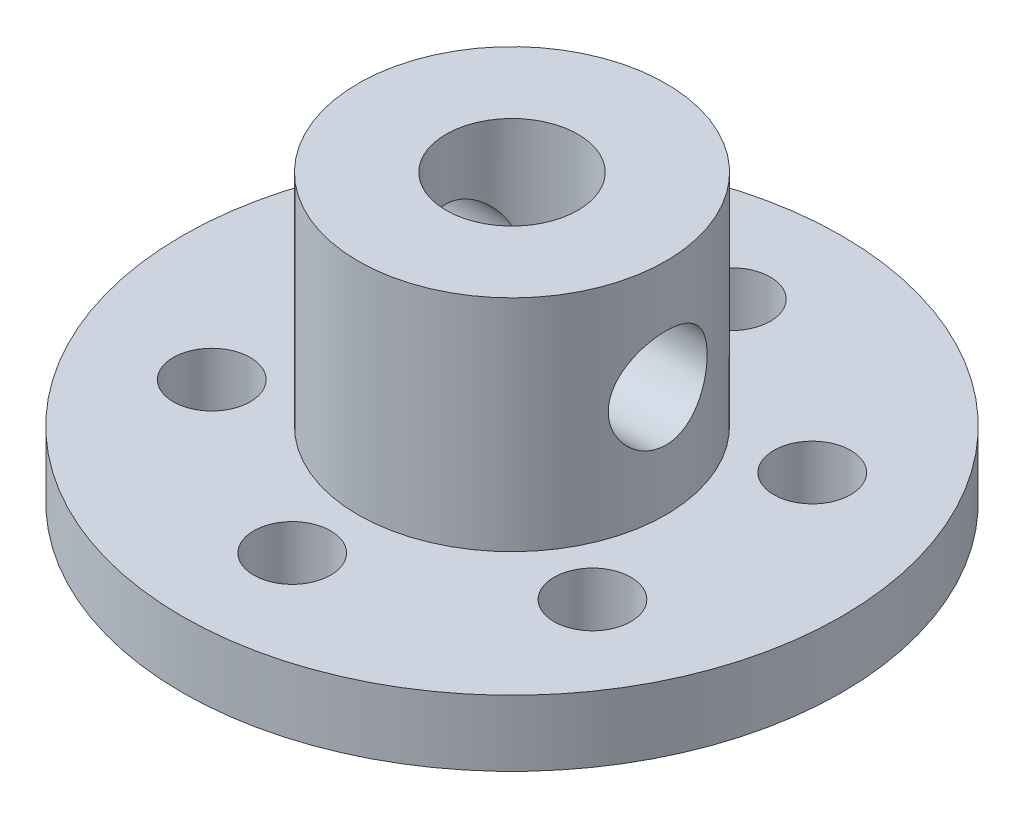
ISO-10303-21;
HEADER;
FILE_DESCRIPTION(('STEP AP214'),'2;1');
FILE_NAME('part.step','',(''),(''),'','','');
FILE_SCHEMA(('AUTOMOTIVE_DESIGN { 1 0 10303 214 1 1 1 1 }'));
ENDSEC;
DATA;
#1=APPLICATION_CONTEXT('core data for automotive mechanical design processes');
#2=APPLICATION_PROTOCOL_DEFINITION('international standard','automotive_design',2000,#1);
#3=PRODUCT_CONTEXT('',#1,'mechanical');
#4=PRODUCT('Part','Part','',(#3));
#5=PRODUCT_RELATED_PRODUCT_CATEGORY('part','',(#4));
#6=PRODUCT_DEFINITION_FORMATION('','',#4);
#7=PRODUCT_DEFINITION_CONTEXT('part definition',#1,'design');
#8=PRODUCT_DEFINITION('design','',#6,#7);
#9=PRODUCT_DEFINITION_SHAPE('','',#8);
#10=(LENGTH_UNIT() NAMED_UNIT(*) SI_UNIT(.MILLI.,.METRE.));
#11=(NAMED_UNIT(*) PLANE_ANGLE_UNIT() SI_UNIT($,.RADIAN.));
#12=(NAMED_UNIT(*) SI_UNIT($,.STERADIAN.) SOLID_ANGLE_UNIT());
#13=UNCERTAINTY_MEASURE_WITH_UNIT(LENGTH_MEASURE(1.E-05),#10,'distance_accuracy_value','');
#14=(GEOMETRIC_REPRESENTATION_CONTEXT(3) GLOBAL_UNCERTAINTY_ASSIGNED_CONTEXT((#13)) GLOBAL_UNIT_ASSIGNED_CONTEXT((#10,
#11,#12)) REPRESENTATION_CONTEXT('',''));
#15=CARTESIAN_POINT('',(0.,0.,0.));
#16=DIRECTION('',(0.,0.,1.));
#17=DIRECTION('',(1.,0.,0.));
#18=AXIS2_PLACEMENT_3D('',#15,#16,#17);
#19=CARTESIAN_POINT('',(0.,3.,-10.));
#20=DIRECTION('',(0.,-1.,0.));
#21=DIRECTION('',(0.,0.,-1.));
#22=AXIS2_PLACEMENT_3D('',#19,#20,#21);
#23=CYLINDRICAL_SURFACE('',#22,1.75);
#24=CARTESIAN_POINT('',(0.,3.,-10.));
#25=DIRECTION('',(0.,1.,0.));
#26=DIRECTION('',(0.,0.,1.));
#27=AXIS2_PLACEMENT_3D('',#24,#25,#26);
#28=CIRCLE('',#27,1.75);
#29=CARTESIAN_POINT('',(0.,3.,-8.25));
#30=VERTEX_POINT('',#29);
#31=EDGE_CURVE('E52',#30,#30,#28,.T.);
#32=ORIENTED_EDGE('',*,*,#31,.T.);
#33=EDGE_LOOP('',(#32));
#34=FACE_BOUND('',#33,.T.);
#35=CARTESIAN_POINT('',(0.,0.,-10.));
#36=DIRECTION('',(0.,1.,0.));
#37=DIRECTION('',(0.,0.,1.));
#38=AXIS2_PLACEMENT_3D('',#35,#36,#37);
#39=CIRCLE('',#38,1.75);
#40=CARTESIAN_POINT('',(0.,0.,-8.25));
#41=VERTEX_POINT('',#40);
#42=EDGE_CURVE('E72',#41,#41,#39,.T.);
#43=ORIENTED_EDGE('',*,*,#42,.F.);
#44=EDGE_LOOP('',(#43));
#45=FACE_BOUND('',#44,.T.);
#46=ADVANCED_FACE('F34',(#34,#45),#23,.F.);
#47=CARTESIAN_POINT('',(8.6602540378446,3.,-5.00000000000037));
#48=DIRECTION('',(0.,-1.,0.));
#49=DIRECTION('',(0.,0.,-1.));
#50=AXIS2_PLACEMENT_3D('',#47,#48,#49);
#51=CYLINDRICAL_SURFACE('',#50,1.75000000000012);
#52=CARTESIAN_POINT('',(8.6602540378446,3.,-5.00000000000037));
#53=DIRECTION('',(0.,1.,0.));
#54=DIRECTION('',(0.,0.,1.));
#55=AXIS2_PLACEMENT_3D('',#52,#53,#54);
#56=CIRCLE('',#55,1.75000000000012);
#57=CARTESIAN_POINT('',(8.6602540378446,3.,-3.25000000000025));
#58=VERTEX_POINT('',#57);
#59=EDGE_CURVE('E183',#58,#58,#56,.T.);
#60=ORIENTED_EDGE('',*,*,#59,.T.);
#61=EDGE_LOOP('',(#60));
#62=FACE_BOUND('',#61,.T.);
#63=CARTESIAN_POINT('',(8.6602540378446,0.,-5.00000000000037));
#64=DIRECTION('',(0.,1.,0.));
#65=DIRECTION('',(0.,0.,1.));
#66=AXIS2_PLACEMENT_3D('',#63,#64,#65);
#67=CIRCLE('',#66,1.75000000000012);
#68=CARTESIAN_POINT('',(8.6602540378446,0.,-3.25000000000025));
#69=VERTEX_POINT('',#68);
#70=EDGE_CURVE('E69',#69,#69,#67,.T.);
#71=ORIENTED_EDGE('',*,*,#70,.F.);
#72=EDGE_LOOP('',(#71));
#73=FACE_BOUND('',#72,.T.);
#74=ADVANCED_FACE('F128',(#62,#73),#51,.F.);
#75=CARTESIAN_POINT('',(8.66025403784503,3.,4.99999999999963));
#76=DIRECTION('',(0.,-1.,0.));
#77=DIRECTION('',(0.,0.,-1.));
#78=AXIS2_PLACEMENT_3D('',#75,#76,#77);
#79=CYLINDRICAL_SURFACE('',#78,1.75000000000055);
#80=CARTESIAN_POINT('',(8.66025403784503,3.,4.99999999999963));
#81=DIRECTION('',(0.,1.,0.));
#82=DIRECTION('',(0.,0.,1.));
#83=AXIS2_PLACEMENT_3D('',#80,#81,#82);
#84=CIRCLE('',#83,1.75000000000055);
#85=CARTESIAN_POINT('',(8.66025403784503,3.,6.75000000000018));
#86=VERTEX_POINT('',#85);
#87=EDGE_CURVE('E180',#86,#86,#84,.T.);
#88=ORIENTED_EDGE('',*,*,#87,.T.);
#89=EDGE_LOOP('',(#88));
#90=FACE_BOUND('',#89,.T.);
#91=CARTESIAN_POINT('',(8.66025403784503,0.,4.99999999999963));
#92=DIRECTION('',(0.,1.,0.));
#93=DIRECTION('',(0.,0.,1.));
#94=AXIS2_PLACEMENT_3D('',#91,#92,#93);
#95=CIRCLE('',#94,1.75000000000055);
#96=CARTESIAN_POINT('',(8.66025403784503,0.,6.75000000000018));
#97=VERTEX_POINT('',#96);
#98=EDGE_CURVE('E66',#97,#97,#95,.T.);
#99=ORIENTED_EDGE('',*,*,#98,.F.);
#100=EDGE_LOOP('',(#99));
#101=FACE_BOUND('',#100,.T.);
#102=ADVANCED_FACE('F132',(#90,#101),#79,.F.);
#103=CARTESIAN_POINT('',(8.48977342514678E-13,3.,10.));
#104=DIRECTION('',(0.,-1.,0.));
#105=DIRECTION('',(0.,0.,-1.));
#106=AXIS2_PLACEMENT_3D('',#103,#104,#105);
#107=CYLINDRICAL_SURFACE('',#106,1.75000000000088);
#108=CARTESIAN_POINT('',(8.48977342514678E-13,3.,10.));
#109=DIRECTION('',(0.,1.,0.));
#110=DIRECTION('',(0.,0.,1.));
#111=AXIS2_PLACEMENT_3D('',#108,#109,#110);
#112=CIRCLE('',#111,1.75000000000088);
#113=CARTESIAN_POINT('',(8.48977342514678E-13,3.,11.7500000000009));
#114=VERTEX_POINT('',#113);
#115=EDGE_CURVE('E177',#114,#114,#112,.T.);
#116=ORIENTED_EDGE('',*,*,#115,.T.);
#117=EDGE_LOOP('',(#116));
#118=FACE_BOUND('',#117,.T.);
#119=CARTESIAN_POINT('',(8.48977342514678E-13,0.,10.));
#120=DIRECTION('',(0.,1.,0.));
#121=DIRECTION('',(0.,0.,1.));
#122=AXIS2_PLACEMENT_3D('',#119,#120,#121);
#123=CIRCLE('',#122,1.75000000000088);
#124=CARTESIAN_POINT('',(8.48977342514678E-13,0.,11.7500000000009));
#125=VERTEX_POINT('',#124);
#126=EDGE_CURVE('E63',#125,#125,#123,.T.);
#127=ORIENTED_EDGE('',*,*,#126,.F.);
#128=EDGE_LOOP('',(#127));
#129=FACE_BOUND('',#128,.T.);
#130=ADVANCED_FACE('F136',(#118,#129),#107,.F.);
#131=CARTESIAN_POINT('',(-8.66025403784375,3.,5.00000000000037));
#132=DIRECTION('',(0.,-1.,0.));
#133=DIRECTION('',(0.,0.,-1.));
#134=AXIS2_PLACEMENT_3D('',#131,#132,#133);
#135=CYLINDRICAL_SURFACE('',#134,1.75000000000081);
#136=CARTESIAN_POINT('',(-8.66025403784375,3.,5.00000000000037));
#137=DIRECTION('',(0.,1.,0.));
#138=DIRECTION('',(0.,0.,1.));
#139=AXIS2_PLACEMENT_3D('',#136,#137,#138);
#140=CIRCLE('',#139,1.75000000000081);
#141=CARTESIAN_POINT('',(-8.66025403784375,3.,6.75000000000118));
#142=VERTEX_POINT('',#141);
#143=EDGE_CURVE('E150',#142,#142,#140,.T.);
#144=ORIENTED_EDGE('',*,*,#143,.T.);
#145=EDGE_LOOP('',(#144));
#146=FACE_BOUND('',#145,.T.);
#147=CARTESIAN_POINT('',(-8.66025403784375,0.,5.00000000000037));
#148=DIRECTION('',(0.,1.,0.));
#149=DIRECTION('',(0.,0.,1.));
#150=AXIS2_PLACEMENT_3D('',#147,#148,#149);
#151=CIRCLE('',#150,1.75000000000081);
#152=CARTESIAN_POINT('',(-8.66025403784375,0.,6.75000000000118));
#153=VERTEX_POINT('',#152);
#154=EDGE_CURVE('E59',#153,#153,#151,.T.);
#155=ORIENTED_EDGE('',*,*,#154,.F.);
#156=EDGE_LOOP('',(#155));
#157=FACE_BOUND('',#156,.T.);
#158=ADVANCED_FACE('F139',(#146,#157),#135,.F.);
#159=CARTESIAN_POINT('',(-8.66025403784418,3.,-4.99999999999963));
#160=DIRECTION('',(0.,-1.,0.));
#161=DIRECTION('',(0.,0.,-1.));
#162=AXIS2_PLACEMENT_3D('',#159,#160,#161);
#163=CYLINDRICAL_SURFACE('',#162,1.75000000000043);
#164=CARTESIAN_POINT('',(-8.66025403784418,3.,-4.99999999999963));
#165=DIRECTION('',(0.,1.,0.));
#166=DIRECTION('',(0.,0.,1.));
#167=AXIS2_PLACEMENT_3D('',#164,#165,#166);
#168=CIRCLE('',#167,1.75000000000043);
#169=CARTESIAN_POINT('',(-8.66025403784418,3.,-3.2499999999992));
#170=VERTEX_POINT('',#169);
#171=EDGE_CURVE('E77',#170,#170,#168,.T.);
#172=ORIENTED_EDGE('',*,*,#171,.T.);
#173=EDGE_LOOP('',(#172));
#174=FACE_BOUND('',#173,.T.);
#175=CARTESIAN_POINT('',(-8.66025403784418,0.,-4.99999999999963));
#176=DIRECTION('',(0.,1.,0.));
#177=DIRECTION('',(0.,0.,1.));
#178=AXIS2_PLACEMENT_3D('',#175,#176,#177);
#179=CIRCLE('',#178,1.75000000000043);
#180=CARTESIAN_POINT('',(-8.66025403784418,0.,-3.2499999999992));
#181=VERTEX_POINT('',#180);
#182=EDGE_CURVE('E56',#181,#181,#179,.T.);
#183=ORIENTED_EDGE('',*,*,#182,.F.);
#184=EDGE_LOOP('',(#183));
#185=FACE_BOUND('',#184,.T.);
#186=ADVANCED_FACE('F36',(#174,#185),#163,.F.);
#187=CARTESIAN_POINT('',(0.,3.,0.));
#188=DIRECTION('',(0.,-1.,0.));
#189=DIRECTION('',(0.,0.,-1.));
#190=AXIS2_PLACEMENT_3D('',#187,#188,#189);
#191=CYLINDRICAL_SURFACE('',#190,15.);
#192=CARTESIAN_POINT('',(0.,3.,0.));
#193=DIRECTION('',(0.,1.,0.));
#194=DIRECTION('',(0.,0.,1.));
#195=AXIS2_PLACEMENT_3D('',#192,#193,#194);
#196=CIRCLE('',#195,15.);
#197=CARTESIAN_POINT('',(0.,3.,15.));
#198=VERTEX_POINT('',#197);
#199=EDGE_CURVE('E10',#198,#198,#196,.T.);
#200=ORIENTED_EDGE('',*,*,#199,.F.);
#201=EDGE_LOOP('',(#200));
#202=FACE_BOUND('',#201,.T.);
#203=CARTESIAN_POINT('',(0.,0.,0.));
#204=DIRECTION('',(0.,1.,0.));
#205=DIRECTION('',(0.,0.,1.));
#206=AXIS2_PLACEMENT_3D('',#203,#204,#205);
#207=CIRCLE('',#206,15.);
#208=CARTESIAN_POINT('',(0.,0.,15.));
#209=VERTEX_POINT('',#208);
#210=EDGE_CURVE('E75',#209,#209,#207,.T.);
#211=ORIENTED_EDGE('',*,*,#210,.T.);
#212=EDGE_LOOP('',(#211));
#213=FACE_BOUND('',#212,.T.);
#214=ADVANCED_FACE('F118',(#202,#213),#191,.T.);
#215=CARTESIAN_POINT('',(0.,3.,0.));
#216=DIRECTION('',(0.,1.,0.));
#217=DIRECTION('',(0.,0.,1.));
#218=AXIS2_PLACEMENT_3D('',#215,#216,#217);
#219=PLANE('',#218);
#220=ORIENTED_EDGE('',*,*,#171,.F.);
#221=EDGE_LOOP('',(#220));
#222=FACE_BOUND('',#221,.T.);
#223=ORIENTED_EDGE('',*,*,#143,.F.);
#224=EDGE_LOOP('',(#223));
#225=FACE_BOUND('',#224,.T.);
#226=ORIENTED_EDGE('',*,*,#115,.F.);
#227=EDGE_LOOP('',(#226));
#228=FACE_BOUND('',#227,.T.);
#229=ORIENTED_EDGE('',*,*,#87,.F.);
#230=EDGE_LOOP('',(#229));
#231=FACE_BOUND('',#230,.T.);
#232=ORIENTED_EDGE('',*,*,#59,.F.);
#233=EDGE_LOOP('',(#232));
#234=FACE_BOUND('',#233,.T.);
#235=ORIENTED_EDGE('',*,*,#31,.F.);
#236=EDGE_LOOP('',(#235));
#237=FACE_BOUND('',#236,.T.);
#238=CARTESIAN_POINT('',(0.,3.,0.));
#239=DIRECTION('',(0.,1.,0.));
#240=DIRECTION('',(0.,0.,1.));
#241=AXIS2_PLACEMENT_3D('',#238,#239,#240);
#242=CIRCLE('',#241,7.);
#243=CARTESIAN_POINT('',(0.,3.,7.));
#244=VERTEX_POINT('',#243);
#245=EDGE_CURVE('E47',#244,#244,#242,.T.);
#246=ORIENTED_EDGE('',*,*,#245,.F.);
#247=EDGE_LOOP('',(#246));
#248=FACE_BOUND('',#247,.T.);
#249=ORIENTED_EDGE('',*,*,#199,.T.);
#250=EDGE_LOOP('',(#249));
#251=FACE_BOUND('',#250,.T.);
#252=ADVANCED_FACE('F114',(#222,#225,#228,#231,#234,#237,#248,#251),#219,.T.);
#253=CARTESIAN_POINT('',(0.,0.,0.));
#254=DIRECTION('',(0.,1.,0.));
#255=DIRECTION('',(0.,0.,1.));
#256=AXIS2_PLACEMENT_3D('',#253,#254,#255);
#257=PLANE('',#256);
#258=ORIENTED_EDGE('',*,*,#182,.T.);
#259=EDGE_LOOP('',(#258));
#260=FACE_BOUND('',#259,.T.);
#261=ORIENTED_EDGE('',*,*,#154,.T.);
#262=EDGE_LOOP('',(#261));
#263=FACE_BOUND('',#262,.T.);
#264=ORIENTED_EDGE('',*,*,#126,.T.);
#265=EDGE_LOOP('',(#264));
#266=FACE_BOUND('',#265,.T.);
#267=ORIENTED_EDGE('',*,*,#98,.T.);
#268=EDGE_LOOP('',(#267));
#269=FACE_BOUND('',#268,.T.);
#270=ORIENTED_EDGE('',*,*,#70,.T.);
#271=EDGE_LOOP('',(#270));
#272=FACE_BOUND('',#271,.T.);
#273=ORIENTED_EDGE('',*,*,#42,.T.);
#274=EDGE_LOOP('',(#273));
#275=FACE_BOUND('',#274,.T.);
#276=ORIENTED_EDGE('',*,*,#210,.F.);
#277=EDGE_LOOP('',(#276));
#278=FACE_BOUND('',#277,.T.);
#279=CARTESIAN_POINT('',(0.,0.,0.));
#280=DIRECTION('',(0.,1.,0.));
#281=DIRECTION('',(0.,0.,1.));
#282=AXIS2_PLACEMENT_3D('',#279,#280,#281);
#283=CIRCLE('',#282,3.);
#284=CARTESIAN_POINT('',(0.,0.,3.));
#285=VERTEX_POINT('',#284);
#286=EDGE_CURVE('E166',#285,#285,#283,.T.);
#287=ORIENTED_EDGE('',*,*,#286,.T.);
#288=EDGE_LOOP('',(#287));
#289=FACE_BOUND('',#288,.T.);
#290=ADVANCED_FACE('F112',(#260,#263,#266,#269,#272,#275,#278,#289),#257,.F.);
#291=CARTESIAN_POINT('',(0.,13.,0.));
#292=DIRECTION('',(0.,-1.,0.));
#293=DIRECTION('',(0.,0.,-1.));
#294=AXIS2_PLACEMENT_3D('',#291,#292,#293);
#295=CYLINDRICAL_SURFACE('',#294,3.);
#296=CARTESIAN_POINT('',(-1.98431348329844,8.,-2.25));
#297=CARTESIAN_POINT('',(-1.98430913145681,8.05253000637401,-2.25000210913806));
#298=CARTESIAN_POINT('',(-1.98641066435694,8.1050432178315,-2.24815571996776));
#299=CARTESIAN_POINT('',(-1.99466203322761,8.20950378106812,-2.24083750650961));
#300=CARTESIAN_POINT('',(-2.00081321987037,8.26145093817408,-2.23536447263086));
#301=CARTESIAN_POINT('',(-2.02488332068211,8.41588442301048,-2.2136693211716));
#302=CARTESIAN_POINT('',(-2.04841714829757,8.51680522457672,-2.19217178117551));
#303=CARTESIAN_POINT('',(-2.10562073450256,8.71039880683929,-2.1372589629075));
#304=CARTESIAN_POINT('',(-2.1391461691373,8.8031661738095,-2.10401220435271));
#305=CARTESIAN_POINT('',(-2.21229837981611,8.98151017396956,-2.02695987680636));
#306=CARTESIAN_POINT('',(-2.25192441823052,9.06708767456177,-1.98315558397443));
#307=CARTESIAN_POINT('',(-2.34265965298576,9.24817282177517,-1.87559675202557));
#308=CARTESIAN_POINT('',(-2.39443565070183,9.3420062166506,-1.80958530404729));
#309=CARTESIAN_POINT('',(-2.49781536778976,9.51878387765167,-1.66401226891677));
#310=CARTESIAN_POINT('',(-2.54941871770906,9.60171178563173,-1.58443072825868));
#311=CARTESIAN_POINT('',(-2.65894887860591,9.77130455899129,-1.39437748434401));
#312=CARTESIAN_POINT('',(-2.71601549244097,9.85527520541064,-1.28091634067474));
#313=CARTESIAN_POINT('',(-2.79272660238602,9.9653229317012,-1.0977605570338));
#314=CARTESIAN_POINT('',(-2.81680831792418,9.99934459312345,-1.03457343361326));
#315=CARTESIAN_POINT('',(-2.86132111801415,10.0615855820249,-0.904200951065687));
#316=CARTESIAN_POINT('',(-2.88175413299219,10.0898079789325,-0.83701773139531));
#317=CARTESIAN_POINT('',(-2.92549194461097,10.1497857871049,-0.671847569253304));
#318=CARTESIAN_POINT('',(-2.94673978684491,10.1785287487161,-0.572180869406519));
#319=CARTESIAN_POINT('',(-2.97909041091837,10.2220920632453,-0.368317129372992));
#320=CARTESIAN_POINT('',(-2.99020200661715,10.2369245122092,-0.264124107760118));
#321=CARTESIAN_POINT('',(-3.0013690544574,10.2518307479551,-0.0538008083585282));
#322=CARTESIAN_POINT('',(-3.00139577815147,10.2518661856121,0.052333790312271));
#323=CARTESIAN_POINT('',(-2.99031352035484,10.237073590897,0.26297508357321));
#324=CARTESIAN_POINT('',(-2.97920196005587,10.2222421164403,0.367481395481368));
#325=CARTESIAN_POINT('',(-2.94737056149871,10.1793782977926,0.568333574604241));
#326=CARTESIAN_POINT('',(-2.92699283753323,10.151815476451,0.664836344248802));
#327=CARTESIAN_POINT('',(-2.87823420881353,10.0850065707025,0.851520785687917));
#328=CARTESIAN_POINT('',(-2.84985155904422,10.0457579387706,0.941701073870062));
#329=CARTESIAN_POINT('',(-2.78341568075581,9.95220556670866,1.12382536471045));
#330=CARTESIAN_POINT('',(-2.74464810669173,9.89673185222044,1.21490307219253));
#331=CARTESIAN_POINT('',(-2.66191053968789,9.77489944689809,1.38685088070447));
#332=CARTESIAN_POINT('',(-2.61793612241102,9.708531480279,1.46771217835074));
#333=CARTESIAN_POINT('',(-2.51840648724264,9.55216497577669,1.6336230625519));
#334=CARTESIAN_POINT('',(-2.46227483777561,9.46008618468967,1.71636739460329));
#335=CARTESIAN_POINT('',(-2.35088937447656,9.26324812483794,1.86601313381211));
#336=CARTESIAN_POINT('',(-2.29563599048956,9.15848285080327,1.93290699334772));
#337=CARTESIAN_POINT('',(-2.20229138995792,8.9585271945586,2.03809809603304));
#338=CARTESIAN_POINT('',(-2.16296399688531,8.86551943196058,2.07943300281538));
#339=CARTESIAN_POINT('',(-2.09305111882542,8.67190207795917,2.14979095683744));
#340=CARTESIAN_POINT('',(-2.06244592963654,8.5713102807444,2.17884182780536));
#341=CARTESIAN_POINT('',(-2.01960075944069,8.38446958377805,2.21853577971363));
#342=CARTESIAN_POINT('',(-2.00492309382469,8.29932937607255,2.2316860406119));
#343=CARTESIAN_POINT('',(-1.98653382610398,8.12696680149045,2.2480764111313));
#344=CARTESIAN_POINT('',(-1.98280819412855,8.03974724292471,2.25132919988714));
#345=CARTESIAN_POINT('',(-1.98694303360416,7.86578150961994,2.24767904494262));
#346=CARTESIAN_POINT('',(-1.99480776962418,7.77903552091533,2.24077236316054));
#347=CARTESIAN_POINT('',(-2.02081827509784,7.60838578172358,2.21733793445464));
#348=CARTESIAN_POINT('',(-2.03898159152914,7.52448714187542,2.20079376561917));
#349=CARTESIAN_POINT('',(-2.09141640782381,7.33049287927233,2.15120926318925));
#350=CARTESIAN_POINT('',(-2.1291725022407,7.22234583555502,2.11431227597653));
#351=CARTESIAN_POINT('',(-2.2130677691471,7.0155387385444,2.02633373919423));
#352=CARTESIAN_POINT('',(-2.25922232203506,6.91689660742519,1.97522607288915));
#353=CARTESIAN_POINT('',(-2.35662481047889,6.72597557317888,1.85804437723557));
#354=CARTESIAN_POINT('',(-2.40799544022375,6.63404721260986,1.79150316703591));
#355=CARTESIAN_POINT('',(-2.51021041048941,6.46100033021233,1.64524693171989));
#356=CARTESIAN_POINT('',(-2.56105448251327,6.37988709477778,1.5655255064967));
#357=CARTESIAN_POINT('',(-2.66941328083733,6.21306869268066,1.37431312650337));
#358=CARTESIAN_POINT('',(-2.72596347580553,6.13022211593967,1.25968556381384));
#359=CARTESIAN_POINT('',(-2.80162738306581,6.02205627527861,1.07486565430162));
#360=CARTESIAN_POINT('',(-2.82531688721539,5.98869149149061,1.01113058136446));
#361=CARTESIAN_POINT('',(-2.8689528173044,5.92784093008219,0.879713816918696));
#362=CARTESIAN_POINT('',(-2.88890126264425,5.90035197959648,0.812034280619927));
#363=CARTESIAN_POINT('',(-2.93126893789208,5.8423689307732,0.646178128381582));
#364=CARTESIAN_POINT('',(-2.95162623521854,5.81487175239984,0.546387042114059));
#365=CARTESIAN_POINT('',(-2.98215991374702,5.7737998694436,0.342534752032168));
#366=CARTESIAN_POINT('',(-2.99234539715333,5.76021271725889,0.238477452798641));
#367=CARTESIAN_POINT('',(-3.00170190648133,5.74772727838325,0.0287246204599633));
#368=CARTESIAN_POINT('',(-3.00084707643932,5.74886347319116,-0.0769741790791737));
#369=CARTESIAN_POINT('',(-2.98813247561515,5.76584098760534,-0.286514376575641));
#370=CARTESIAN_POINT('',(-2.97626977310056,5.78168622467896,-0.390355272206487));
#371=CARTESIAN_POINT('',(-2.94305090422116,5.82646250230456,-0.590282682162038));
#372=CARTESIAN_POINT('',(-2.92198033216131,5.85500030598716,-0.686506795522206));
#373=CARTESIAN_POINT('',(-2.87194083836528,5.9236820644163,-0.872492073903725));
#374=CARTESIAN_POINT('',(-2.84297022719776,5.96382850179189,-0.962251851324234));
#375=CARTESIAN_POINT('',(-2.77526462284845,6.05941691524951,-1.14382153006944));
#376=CARTESIAN_POINT('',(-2.73579528389032,6.11607639231364,-1.23471185209403));
#377=CARTESIAN_POINT('',(-2.65178259786535,6.24029966556143,-1.40612222056517));
#378=CARTESIAN_POINT('',(-2.60723459853551,6.30787348373018,-1.48663261238177));
#379=CARTESIAN_POINT('',(-2.50659527574694,6.46700801654037,-1.65168571732869));
#380=CARTESIAN_POINT('',(-2.44996375982007,6.56066945956788,-1.73387541001293));
#381=CARTESIAN_POINT('',(-2.3379913147288,6.76080224749285,-1.88212876454378));
#382=CARTESIAN_POINT('',(-2.28265086510132,6.86727826440393,-1.94818651816193));
#383=CARTESIAN_POINT('',(-2.19074379335966,7.06832446397281,-2.0504396794404));
#384=CARTESIAN_POINT('',(-2.15270360803852,7.16050109014306,-2.09000326459283));
#385=CARTESIAN_POINT('',(-2.08548923478948,7.352125749793,-2.15708060189611));
#386=CARTESIAN_POINT('',(-2.05629156732276,7.45155364112603,-2.18462635234871));
#387=CARTESIAN_POINT('',(-2.0179843508297,7.62617872116757,-2.21995682983429));
#388=CARTESIAN_POINT('',(-2.00549550871957,7.69993897845689,-2.23116684051157));
#389=CARTESIAN_POINT('',(-1.98866587191893,7.84914512039123,-2.24618448301772));
#390=CARTESIAN_POINT('',(-1.98431973064131,7.92458986602316,-2.24999697219942));
#391=CARTESIAN_POINT('',(-1.98431348329844,8.,-2.25));
#392=B_SPLINE_CURVE_WITH_KNOTS('',3,(#296,#297,#298,#299,#300,#301,#302,#303,#304,#305,#306,
#307,#308,#309,#310,#311,#312,#313,#314,#315,#316,#317,#318,#319,#320,#321,#322,#323,#324,#325,
#326,#327,#328,#329,#330,#331,#332,#333,#334,#335,#336,#337,#338,#339,#340,#341,#342,#343,#344,
#345,#346,#347,#348,#349,#350,#351,#352,#353,#354,#355,#356,#357,#358,#359,#360,#361,#362,#363,
#364,#365,#366,#367,#368,#369,#370,#371,#372,#373,#374,#375,#376,#377,#378,#379,#380,#381,#382,
#383,#384,#385,#386,#387,#388,#389,#390,#391),.UNSPECIFIED.,.T.,.F.,(4,2,2,2,2,2,2,2,2,2,2,2,2,
2,2,2,2,2,2,2,2,2,2,2,2,2,2,2,2,2,2,2,2,2,2,2,2,2,2,2,2,2,2,2,2,2,2,4),(0.,0.15748399622368,
0.315020544370727,0.630557463218485,0.941740957774203,1.25288685635251,1.62920100971153,
2.00607334482173,2.459895600797,2.68664089619973,2.91326586920798,3.22946313669686,
3.5453851955942,3.86212601845063,4.17894019215285,4.48490359595928,4.79093374916357,
5.13009991928695,5.46955638084848,5.87579001560406,6.28221670225252,6.60853839969148,
6.93411695672862,7.19516734072204,7.45588316560642,7.71669494242672,7.97795243797382,
8.33699768056949,8.69670719712079,9.06919539388443,9.4418649992328,9.8958347500717,
10.1227033162223,10.3494490653982,10.6644761795161,10.9792211396874,11.2947033531154,
11.6102696132089,11.9166749269784,12.2231458172897,12.5643335239439,12.9058363227694,
13.314896445272,13.7241061597277,14.0449569312123,14.3649481231902,14.5911749177062,
14.8172531170859),.UNSPECIFIED.);
#393=CARTESIAN_POINT('',(-1.98431348329844,8.,-2.25));
#394=VERTEX_POINT('',#393);
#395=EDGE_CURVE('E103',#394,#394,#392,.T.);
#396=ORIENTED_EDGE('',*,*,#395,.F.);
#397=EDGE_LOOP('',(#396));
#398=FACE_BOUND('',#397,.T.);
#399=CARTESIAN_POINT('',(1.98431348329845,8.,-2.25));
#400=CARTESIAN_POINT('',(1.98430913145681,7.94746999362599,-2.25000210913806));
#401=CARTESIAN_POINT('',(1.98641066435694,7.8949567821685,-2.24815571996776));
#402=CARTESIAN_POINT('',(1.99466203322761,7.79049621893188,-2.24083750650961));
#403=CARTESIAN_POINT('',(2.00081321987037,7.73854906182591,-2.23536447263086));
#404=CARTESIAN_POINT('',(2.02488332068211,7.58411557698952,-2.2136693211716));
#405=CARTESIAN_POINT('',(2.04841714829757,7.48319477542328,-2.19217178117551));
#406=CARTESIAN_POINT('',(2.10562073450256,7.28960119316071,-2.1372589629075));
#407=CARTESIAN_POINT('',(2.1391461691373,7.1968338261905,-2.10401220435271));
#408=CARTESIAN_POINT('',(2.21229837981611,7.01848982603044,-2.02695987680636));
#409=CARTESIAN_POINT('',(2.25192441823052,6.93291232543823,-1.98315558397443));
#410=CARTESIAN_POINT('',(2.34265965298576,6.75182717822483,-1.87559675202557));
#411=CARTESIAN_POINT('',(2.39443565070183,6.6579937833494,-1.80958530404729));
#412=CARTESIAN_POINT('',(2.49781536778976,6.48121612234833,-1.66401226891678));
#413=CARTESIAN_POINT('',(2.54941871770906,6.39828821436827,-1.58443072825868));
#414=CARTESIAN_POINT('',(2.65894887860591,6.22869544100871,-1.39437748434401));
#415=CARTESIAN_POINT('',(2.71601549244097,6.14472479458936,-1.28091634067474));
#416=CARTESIAN_POINT('',(2.79272660238602,6.0346770682988,-1.0977605570338));
#417=CARTESIAN_POINT('',(2.81680831792418,6.00065540687655,-1.03457343361327));
#418=CARTESIAN_POINT('',(2.86132111801415,5.93841441797511,-0.904200951065689));
#419=CARTESIAN_POINT('',(2.88175413299219,5.91019202106746,-0.837017731395312));
#420=CARTESIAN_POINT('',(2.92549194461097,5.85021421289506,-0.671847569253306));
#421=CARTESIAN_POINT('',(2.94673978684491,5.82147125128391,-0.57218086940652));
#422=CARTESIAN_POINT('',(2.97909041091837,5.77790793675469,-0.368317129372994));
#423=CARTESIAN_POINT('',(2.99020200661715,5.76307548779081,-0.264124107760119));
#424=CARTESIAN_POINT('',(3.0013690544574,5.74816925204486,-0.0538008083585294));
#425=CARTESIAN_POINT('',(3.00139577815147,5.7481338143879,0.0523337903122697));
#426=CARTESIAN_POINT('',(2.99031352035484,5.76292640910301,0.262975083573209));
#427=CARTESIAN_POINT('',(2.97920196005587,5.77775788355966,0.367481395481367));
#428=CARTESIAN_POINT('',(2.94737056149871,5.82062170220742,0.56833357460424));
#429=CARTESIAN_POINT('',(2.92699283753324,5.84818452354902,0.6648363442488));
#430=CARTESIAN_POINT('',(2.87823420881353,5.91499342929753,0.851520785687915));
#431=CARTESIAN_POINT('',(2.84985155904422,5.95424206122938,0.941701073870061));
#432=CARTESIAN_POINT('',(2.78341568075581,6.04779443329134,1.12382536471045));
#433=CARTESIAN_POINT('',(2.74464810669173,6.10326814777956,1.21490307219253));
#434=CARTESIAN_POINT('',(2.6619105396879,6.22510055310191,1.38685088070447));
#435=CARTESIAN_POINT('',(2.61793612241102,6.291468519721,1.46771217835074));
#436=CARTESIAN_POINT('',(2.51840648724264,6.44783502422331,1.6336230625519));
#437=CARTESIAN_POINT('',(2.46227483777561,6.53991381531033,1.71636739460329));
#438=CARTESIAN_POINT('',(2.35088937447656,6.73675187516206,1.86601313381211));
#439=CARTESIAN_POINT('',(2.29563599048956,6.84151714919673,1.93290699334772));
#440=CARTESIAN_POINT('',(2.20229138995792,7.0414728054414,2.03809809603304));
#441=CARTESIAN_POINT('',(2.16296399688531,7.13448056803942,2.07943300281538));
#442=CARTESIAN_POINT('',(2.09305111882542,7.32809792204083,2.14979095683744));
#443=CARTESIAN_POINT('',(2.06244592963654,7.4286897192556,2.17884182780536));
#444=CARTESIAN_POINT('',(2.01960075944069,7.61553041622195,2.21853577971363));
#445=CARTESIAN_POINT('',(2.00492309382469,7.70067062392745,2.2316860406119));
#446=CARTESIAN_POINT('',(1.98653382610398,7.87303319850955,2.2480764111313));
#447=CARTESIAN_POINT('',(1.98280819412855,7.96025275707529,2.25132919988714));
#448=CARTESIAN_POINT('',(1.98694303360416,8.13421849038006,2.24767904494262));
#449=CARTESIAN_POINT('',(1.99480776962418,8.22096447908467,2.24077236316054));
#450=CARTESIAN_POINT('',(2.02081827509784,8.39161421827642,2.21733793445464));
#451=CARTESIAN_POINT('',(2.03898159152914,8.47551285812458,2.20079376561917));
#452=CARTESIAN_POINT('',(2.09141640782381,8.66950712072767,2.15120926318925));
#453=CARTESIAN_POINT('',(2.1291725022407,8.77765416444498,2.11431227597653));
#454=CARTESIAN_POINT('',(2.2130677691471,8.98446126145561,2.02633373919423));
#455=CARTESIAN_POINT('',(2.25922232203506,9.08310339257481,1.97522607288915));
#456=CARTESIAN_POINT('',(2.3566248104789,9.27402442682112,1.85804437723557));
#457=CARTESIAN_POINT('',(2.40799544022376,9.36595278739014,1.79150316703591));
#458=CARTESIAN_POINT('',(2.51021041048942,9.53899966978767,1.64524693171988));
#459=CARTESIAN_POINT('',(2.56105448251327,9.62011290522222,1.56552550649669));
#460=CARTESIAN_POINT('',(2.66941328083733,9.78693130731935,1.37431312650336));
#461=CARTESIAN_POINT('',(2.72596347580553,9.86977788406033,1.25968556381383));
#462=CARTESIAN_POINT('',(2.80162738306581,9.97794372472139,1.07486565430161));
#463=CARTESIAN_POINT('',(2.82531688721539,10.0113085085094,1.01113058136445));
#464=CARTESIAN_POINT('',(2.86895281730441,10.0721590699178,0.879713816918691));
#465=CARTESIAN_POINT('',(2.88890126264425,10.0996480204035,0.812034280619922));
#466=CARTESIAN_POINT('',(2.93126893789209,10.1576310692268,0.646178128381577));
#467=CARTESIAN_POINT('',(2.95162623521854,10.1851282476002,0.546387042114054));
#468=CARTESIAN_POINT('',(2.98215991374702,10.2262001305564,0.342534752032164));
#469=CARTESIAN_POINT('',(2.99234539715333,10.2397872827411,0.238477452798637));
#470=CARTESIAN_POINT('',(3.00170190648133,10.2522727216167,0.0287246204599586));
#471=CARTESIAN_POINT('',(3.00084707643932,10.2511365268088,-0.0769741790791784));
#472=CARTESIAN_POINT('',(2.98813247561515,10.2341590123947,-0.286514376575645));
#473=CARTESIAN_POINT('',(2.97626977310056,10.218313775321,-0.39035527220649));
#474=CARTESIAN_POINT('',(2.94305090422116,10.1735374976954,-0.590282682162041));
#475=CARTESIAN_POINT('',(2.92198033216131,10.1449996940128,-0.68650679552221));
#476=CARTESIAN_POINT('',(2.87194083836528,10.0763179355837,-0.872492073903728));
#477=CARTESIAN_POINT('',(2.84297022719776,10.0361714982081,-0.962251851324237));
#478=CARTESIAN_POINT('',(2.77526462284845,9.94058308475049,-1.14382153006944));
#479=CARTESIAN_POINT('',(2.73579528389031,9.88392360768636,-1.23471185209403));
#480=CARTESIAN_POINT('',(2.65178259786535,9.75970033443857,-1.40612222056518));
#481=CARTESIAN_POINT('',(2.60723459853551,9.69212651626982,-1.48663261238177));
#482=CARTESIAN_POINT('',(2.50659527574694,9.53299198345962,-1.6516857173287));
#483=CARTESIAN_POINT('',(2.44996375982007,9.43933054043212,-1.73387541001293));
#484=CARTESIAN_POINT('',(2.33799131472879,9.23919775250715,-1.88212876454378));
#485=CARTESIAN_POINT('',(2.28265086510132,9.13272173559606,-1.94818651816193));
#486=CARTESIAN_POINT('',(2.19074379335966,8.93167553602718,-2.0504396794404));
#487=CARTESIAN_POINT('',(2.15270360803851,8.83949890985694,-2.09000326459283));
#488=CARTESIAN_POINT('',(2.08548923478947,8.64787425020699,-2.15708060189611));
#489=CARTESIAN_POINT('',(2.05629156732276,8.54844635887396,-2.18462635234871));
#490=CARTESIAN_POINT('',(2.0179843508297,8.37382127883243,-2.21995682983429));
#491=CARTESIAN_POINT('',(2.00549550871956,8.30006102154311,-2.23116684051157));
#492=CARTESIAN_POINT('',(1.98866587191893,8.15085487960877,-2.24618448301772));
#493=CARTESIAN_POINT('',(1.98431973064132,8.07541013397685,-2.24999697219942));
#494=CARTESIAN_POINT('',(1.98431348329845,8.,-2.25));
#495=B_SPLINE_CURVE_WITH_KNOTS('',3,(#399,#400,#401,#402,#403,#404,#405,#406,#407,#408,#409,
#410,#411,#412,#413,#414,#415,#416,#417,#418,#419,#420,#421,#422,#423,#424,#425,#426,#427,#428,
#429,#430,#431,#432,#433,#434,#435,#436,#437,#438,#439,#440,#441,#442,#443,#444,#445,#446,#447,
#448,#449,#450,#451,#452,#453,#454,#455,#456,#457,#458,#459,#460,#461,#462,#463,#464,#465,#466,
#467,#468,#469,#470,#471,#472,#473,#474,#475,#476,#477,#478,#479,#480,#481,#482,#483,#484,#485,
#486,#487,#488,#489,#490,#491,#492,#493,#494),.UNSPECIFIED.,.T.,.F.,(4,2,2,2,2,2,2,2,2,2,2,2,2,
2,2,2,2,2,2,2,2,2,2,2,2,2,2,2,2,2,2,2,2,2,2,2,2,2,2,2,2,2,2,2,2,2,2,4),(0.,0.157483996223683,
0.315020544370729,0.630557463218484,0.941740957774201,1.25288685635251,1.62920100971153,
2.00607334482173,2.459895600797,2.68664089619973,2.91326586920798,3.22946313669686,
3.54538519559419,3.86212601845063,4.17894019215285,4.48490359595928,4.79093374916357,
5.13009991928695,5.46955638084847,5.87579001560406,6.28221670225252,6.60853839969148,
6.93411695672862,7.19516734072204,7.45588316560642,7.71669494242672,7.97795243797382,
8.33699768056949,8.6967071971208,9.06919539388443,9.44186499923281,9.89583475007171,
10.1227033162223,10.3494490653982,10.6644761795161,10.9792211396874,11.2947033531154,
11.6102696132089,11.9166749269784,12.2231458172897,12.5643335239439,12.9058363227694,
13.3148964452721,13.7241061597277,14.0449569312123,14.3649481231902,14.5911749177062,
14.8172531170859),.UNSPECIFIED.);
#496=CARTESIAN_POINT('',(1.98431348329845,8.,-2.25));
#497=VERTEX_POINT('',#496);
#498=EDGE_CURVE('E98',#497,#497,#495,.T.);
#499=ORIENTED_EDGE('',*,*,#498,.F.);
#500=EDGE_LOOP('',(#499));
#501=FACE_BOUND('',#500,.T.);
#502=CARTESIAN_POINT('',(0.,13.,0.));
#503=DIRECTION('',(0.,1.,0.));
#504=DIRECTION('',(0.,0.,1.));
#505=AXIS2_PLACEMENT_3D('',#502,#503,#504);
#506=CIRCLE('',#505,3.);
#507=CARTESIAN_POINT('',(0.,13.,3.));
#508=VERTEX_POINT('',#507);
#509=EDGE_CURVE('E168',#508,#508,#506,.T.);
#510=ORIENTED_EDGE('',*,*,#509,.T.);
#511=EDGE_LOOP('',(#510));
#512=FACE_BOUND('',#511,.T.);
#513=ORIENTED_EDGE('',*,*,#286,.F.);
#514=EDGE_LOOP('',(#513));
#515=FACE_BOUND('',#514,.T.);
#516=ADVANCED_FACE('F108',(#398,#501,#512,#515),#295,.F.);
#517=CARTESIAN_POINT('',(0.,13.,0.));
#518=DIRECTION('',(0.,-1.,0.));
#519=DIRECTION('',(0.,0.,-1.));
#520=AXIS2_PLACEMENT_3D('',#517,#518,#519);
#521=CYLINDRICAL_SURFACE('',#520,7.);
#522=CARTESIAN_POINT('',(-6.62853679178142,8.,-2.25));
#523=CARTESIAN_POINT('',(-6.62853710184911,8.12282669483706,-2.24999973397483));
#524=CARTESIAN_POINT('',(-6.63198809598701,8.24565683521784,-2.23990831022446));
#525=CARTESIAN_POINT('',(-6.64535372844153,8.4876956931836,-2.1999333617533));
#526=CARTESIAN_POINT('',(-6.65526981940078,8.60690359058509,-2.17004538892178));
#527=CARTESIAN_POINT('',(-6.68032897929812,8.83815533101219,-2.09162150839264));
#528=CARTESIAN_POINT('',(-6.69546237825992,8.95021197628265,-2.04312008095807));
#529=CARTESIAN_POINT('',(-6.72923730407521,9.16463117775544,-1.9289622994797));
#530=CARTESIAN_POINT('',(-6.74787951728054,9.26699183144629,-1.86330258816214));
#531=CARTESIAN_POINT('',(-6.78733173993455,9.46283496307386,-1.71413525899675));
#532=CARTESIAN_POINT('',(-6.80819297067235,9.55591323413377,-1.63011037433463));
#533=CARTESIAN_POINT('',(-6.84929808308586,9.72693033318305,-1.44770347860769));
#534=CARTESIAN_POINT('',(-6.86954187288493,9.80486691723014,-1.34931934333238));
#535=CARTESIAN_POINT('',(-6.90772009162109,9.94519313268042,-1.13806047895867));
#536=CARTESIAN_POINT('',(-6.92558721338161,10.0071634403501,-1.02489398439683));
#537=CARTESIAN_POINT('',(-6.95639855478944,10.1110314138155,-0.78907160201057));
#538=CARTESIAN_POINT('',(-6.96934400242998,10.1529340873093,-0.666418090468889));
#539=CARTESIAN_POINT('',(-6.98849073521196,10.2141188422081,-0.419338067159172));
#540=CARTESIAN_POINT('',(-6.99489771452445,10.2340924483957,-0.295099032149796));
#541=CARTESIAN_POINT('',(-7.00097364210966,10.2530463981718,-0.0448788724710677));
#542=CARTESIAN_POINT('',(-7.00064420822851,10.2520317823819,0.0811018266496109));
#543=CARTESIAN_POINT('',(-6.9934260394811,10.2294861466408,0.326350521728301));
#544=CARTESIAN_POINT('',(-6.98677717394758,10.2087053770762,0.445695687543491));
#545=CARTESIAN_POINT('',(-6.96796481644,10.1484524139779,0.679104732254418));
#546=CARTESIAN_POINT('',(-6.95580095827919,10.1089789792733,0.793168259903416));
#547=CARTESIAN_POINT('',(-6.92701036208066,10.0119978818799,1.01446890225394));
#548=CARTESIAN_POINT('',(-6.91032915404261,9.95426856248964,1.12160150110467));
#549=CARTESIAN_POINT('',(-6.87425253944426,9.82259421753272,1.32488731868748));
#550=CARTESIAN_POINT('',(-6.85485641727709,9.74864491372047,1.42103763049462));
#551=CARTESIAN_POINT('',(-6.81439976805301,9.58280756607198,1.6040991207341));
#552=CARTESIAN_POINT('',(-6.79330355652971,9.4902738064461,1.69041828486491));
#553=CARTESIAN_POINT('',(-6.75255315750024,9.29185381690209,1.84649645652377));
#554=CARTESIAN_POINT('',(-6.73289916123155,9.18596582125739,1.91625327061894));
#555=CARTESIAN_POINT('',(-6.69707188482389,8.96208528454601,2.03796962995555));
#556=CARTESIAN_POINT('',(-6.68094491395509,8.84395862670261,2.08969714130786));
#557=CARTESIAN_POINT('',(-6.6545374911179,8.60002579302305,2.17233394802429));
#558=CARTESIAN_POINT('',(-6.64425479317507,8.47422258792108,2.20325124167041));
#559=CARTESIAN_POINT('',(-6.63120279156749,8.22420650623591,2.24222133818135));
#560=CARTESIAN_POINT('',(-6.62813422424622,8.10015124714026,2.25118551903234));
#561=CARTESIAN_POINT('',(-6.62902464320288,7.85229626191103,2.248563225334));
#562=CARTESIAN_POINT('',(-6.63298246526409,7.7284964968468,2.23698015530062));
#563=CARTESIAN_POINT('',(-6.64718302229486,7.48868291243942,2.1944085874433));
#564=CARTESIAN_POINT('',(-6.65722607426079,7.37254668584002,2.16403601632919));
#565=CARTESIAN_POINT('',(-6.68225050262408,7.14703603066763,2.08547744627584));
#566=CARTESIAN_POINT('',(-6.6972327146475,7.03766274999681,2.03728843291471));
#567=CARTESIAN_POINT('',(-6.73100450759507,6.82515091455977,1.92281855967105));
#568=CARTESIAN_POINT('',(-6.74989478804693,6.72229767233912,1.85603851074139));
#569=CARTESIAN_POINT('',(-6.78915135468425,6.52892615194616,1.70685771845461));
#570=CARTESIAN_POINT('',(-6.80951804530957,6.43841127338714,1.62445268480902));
#571=CARTESIAN_POINT('',(-6.85052237800987,6.26815311485444,1.44202909742046));
#572=CARTESIAN_POINT('',(-6.87113216934906,6.18906323454604,1.34139276201172));
#573=CARTESIAN_POINT('',(-6.90940536791384,6.04886090052854,1.12777413938865));
#574=CARTESIAN_POINT('',(-6.92706889895833,5.98774769125323,1.0147923713313));
#575=CARTESIAN_POINT('',(-6.95736535899947,5.88581139070051,0.780336110513259));
#576=CARTESIAN_POINT('',(-6.97003328722146,5.84484661987702,0.65892797582684));
#577=CARTESIAN_POINT('',(-6.98906421228553,5.78406621674739,0.410462981002188));
#578=CARTESIAN_POINT('',(-6.99542930861611,5.76424354178844,0.283408016581789));
#579=CARTESIAN_POINT('',(-7.00099007846919,5.74690847036096,0.0332541082095941));
#580=CARTESIAN_POINT('',(-7.00048823543378,5.74845481573633,-0.0897736296566599));
#581=CARTESIAN_POINT('',(-6.99310457283613,5.77151843396735,-0.333735894400334));
#582=CARTESIAN_POINT('',(-6.98622321100693,5.79303427400385,-0.4546705708216));
#583=CARTESIAN_POINT('',(-6.96695600425205,5.85481560864726,-0.689353923873004));
#584=CARTESIAN_POINT('',(-6.95464792316913,5.89481659100439,-0.803179067706924));
#585=CARTESIAN_POINT('',(-6.92579523891081,5.99219150877431,-1.02255301317808));
#586=CARTESIAN_POINT('',(-6.90924989040868,6.0495685009163,-1.12810035449584));
#587=CARTESIAN_POINT('',(-6.87291422757443,6.18240123069689,-1.33197397223648));
#588=CARTESIAN_POINT('',(-6.85303009232523,6.25842291248904,-1.42991459574144));
#589=CARTESIAN_POINT('',(-6.81251065196244,6.42540401789834,-1.61195919793863));
#590=CARTESIAN_POINT('',(-6.79187511732778,6.51636803607604,-1.69605890476869));
#591=CARTESIAN_POINT('',(-6.75131123316886,6.71453339755362,-1.85106841340107));
#592=CARTESIAN_POINT('',(-6.73143429418086,6.82219787338217,-1.92140134673174));
#593=CARTESIAN_POINT('',(-6.69556246515116,7.04842616712832,-2.04290919002386));
#594=CARTESIAN_POINT('',(-6.67956623344939,7.16698619857102,-2.09409072444395));
#595=CARTESIAN_POINT('',(-6.65437350526039,7.40332182418068,-2.17276508566958));
#596=CARTESIAN_POINT('',(-6.64478667251888,7.52059613693335,-2.20163903087341));
#597=CARTESIAN_POINT('',(-6.6318690546864,7.75857984963504,-2.24025389294519));
#598=CARTESIAN_POINT('',(-6.6285364870528,7.87928826086377,-2.25000026144448));
#599=CARTESIAN_POINT('',(-6.62853679178142,8.,-2.25));
#600=B_SPLINE_CURVE_WITH_KNOTS('',3,(#522,#523,#524,#525,#526,#527,#528,#529,#530,#531,#532,
#533,#534,#535,#536,#537,#538,#539,#540,#541,#542,#543,#544,#545,#546,#547,#548,#549,#550,#551,
#552,#553,#554,#555,#556,#557,#558,#559,#560,#561,#562,#563,#564,#565,#566,#567,#568,#569,#570,
#571,#572,#573,#574,#575,#576,#577,#578,#579,#580,#581,#582,#583,#584,#585,#586,#587,#588,#589,
#590,#591,#592,#593,#594,#595,#596,#597,#598,#599),.UNSPECIFIED.,.T.,.F.,(4,2,2,2,2,2,2,2,2,2,2,
2,2,2,2,2,2,2,2,2,2,2,2,2,2,2,2,2,2,2,2,2,2,2,2,2,2,2,4),(0.,0.36803371606576,0.736150154140144,
1.10358794559797,1.47109768563319,1.85072951841003,2.23041756838432,2.61924382166431,
3.0079729962183,3.38405645180652,3.76004958662664,4.12231806059275,4.48461059213303,
4.85148272913003,5.21845175035283,5.60155383503392,5.98470662752968,6.37262271678031,
6.76038962755114,7.13176299761051,7.50307483980543,7.86281647495648,8.22261900384073,
8.59321096377895,8.96390482812937,9.35099247338617,9.73806384687911,10.1223730531128,
10.5065542019175,10.8738690626464,11.2411575704257,11.6033457991055,11.9655977797684,
12.3406181844134,12.7157541192126,13.1042590383688,13.4926294493829,13.8544291174087,
14.2161256524005),.UNSPECIFIED.);
#601=CARTESIAN_POINT('',(-6.62853679178142,8.,-2.25));
#602=VERTEX_POINT('',#601);
#603=EDGE_CURVE('E38',#602,#602,#600,.T.);
#604=ORIENTED_EDGE('',*,*,#603,.T.);
#605=EDGE_LOOP('',(#604));
#606=FACE_BOUND('',#605,.T.);
#607=CARTESIAN_POINT('',(6.62853679178143,8.,-2.25));
#608=CARTESIAN_POINT('',(6.62853710184912,7.87717330516294,-2.24999973397483));
#609=CARTESIAN_POINT('',(6.63198809598701,7.75434316478216,-2.23990831022446));
#610=CARTESIAN_POINT('',(6.64535372844153,7.5123043068164,-2.1999333617533));
#611=CARTESIAN_POINT('',(6.65526981940078,7.39309640941491,-2.17004538892178));
#612=CARTESIAN_POINT('',(6.68032897929812,7.16184466898781,-2.09162150839264));
#613=CARTESIAN_POINT('',(6.69546237825992,7.04978802371735,-2.04312008095807));
#614=CARTESIAN_POINT('',(6.72923730407521,6.83536882224456,-1.9289622994797));
#615=CARTESIAN_POINT('',(6.74787951728054,6.73300816855371,-1.86330258816214));
#616=CARTESIAN_POINT('',(6.78733173993455,6.53716503692614,-1.71413525899675));
#617=CARTESIAN_POINT('',(6.80819297067235,6.44408676586623,-1.63011037433463));
#618=CARTESIAN_POINT('',(6.84929808308586,6.27306966681695,-1.44770347860769));
#619=CARTESIAN_POINT('',(6.86954187288493,6.19513308276986,-1.34931934333238));
#620=CARTESIAN_POINT('',(6.90772009162109,6.05480686731958,-1.13806047895867));
#621=CARTESIAN_POINT('',(6.92558721338161,5.99283655964993,-1.02489398439683));
#622=CARTESIAN_POINT('',(6.95639855478944,5.88896858618454,-0.789071602010571));
#623=CARTESIAN_POINT('',(6.96934400242998,5.84706591269074,-0.66641809046889));
#624=CARTESIAN_POINT('',(6.98849073521196,5.78588115779188,-0.419338067159172));
#625=CARTESIAN_POINT('',(6.99489771452445,5.76590755160431,-0.295099032149797));
#626=CARTESIAN_POINT('',(7.00097364210966,5.74695360182816,-0.044878872471068));
#627=CARTESIAN_POINT('',(7.00064420822851,5.7479682176181,0.0811018266496106));
#628=CARTESIAN_POINT('',(6.9934260394811,5.77051385335917,0.3263505217283));
#629=CARTESIAN_POINT('',(6.98677717394758,5.79129462292383,0.445695687543491));
#630=CARTESIAN_POINT('',(6.96796481644,5.85154758602211,0.679104732254418));
#631=CARTESIAN_POINT('',(6.95580095827919,5.89102102072672,0.793168259903416));
#632=CARTESIAN_POINT('',(6.92701036208066,5.98800211812007,1.01446890225394));
#633=CARTESIAN_POINT('',(6.91032915404261,6.04573143751036,1.12160150110467));
#634=CARTESIAN_POINT('',(6.87425253944426,6.17740578246728,1.32488731868748));
#635=CARTESIAN_POINT('',(6.85485641727709,6.25135508627953,1.42103763049462));
#636=CARTESIAN_POINT('',(6.81439976805301,6.41719243392802,1.6040991207341));
#637=CARTESIAN_POINT('',(6.79330355652971,6.5097261935539,1.69041828486491));
#638=CARTESIAN_POINT('',(6.75255315750024,6.70814618309791,1.84649645652377));
#639=CARTESIAN_POINT('',(6.73289916123155,6.81403417874261,1.91625327061894));
#640=CARTESIAN_POINT('',(6.69707188482389,7.03791471545399,2.03796962995555));
#641=CARTESIAN_POINT('',(6.68094491395509,7.15604137329739,2.08969714130786));
#642=CARTESIAN_POINT('',(6.6545374911179,7.39997420697695,2.17233394802429));
#643=CARTESIAN_POINT('',(6.64425479317507,7.52577741207892,2.20325124167041));
#644=CARTESIAN_POINT('',(6.63120279156749,7.77579349376409,2.24222133818135));
#645=CARTESIAN_POINT('',(6.62813422424622,7.89984875285974,2.25118551903234));
#646=CARTESIAN_POINT('',(6.62902464320288,8.14770373808896,2.248563225334));
#647=CARTESIAN_POINT('',(6.63298246526409,8.2715035031532,2.23698015530062));
#648=CARTESIAN_POINT('',(6.64718302229486,8.51131708756058,2.1944085874433));
#649=CARTESIAN_POINT('',(6.65722607426079,8.62745331415998,2.16403601632919));
#650=CARTESIAN_POINT('',(6.68225050262408,8.85296396933237,2.08547744627584));
#651=CARTESIAN_POINT('',(6.6972327146475,8.96233725000319,2.03728843291471));
#652=CARTESIAN_POINT('',(6.73100450759507,9.17484908544023,1.92281855967105));
#653=CARTESIAN_POINT('',(6.74989478804693,9.27770232766088,1.85603851074139));
#654=CARTESIAN_POINT('',(6.78915135468425,9.47107384805384,1.70685771845461));
#655=CARTESIAN_POINT('',(6.80951804530957,9.56158872661285,1.62445268480902));
#656=CARTESIAN_POINT('',(6.85052237800987,9.73184688514556,1.44202909742046));
#657=CARTESIAN_POINT('',(6.87113216934906,9.81093676545396,1.34139276201172));
#658=CARTESIAN_POINT('',(6.90940536791384,9.95113909947146,1.12777413938865));
#659=CARTESIAN_POINT('',(6.92706889895833,10.0122523087468,1.0147923713313));
#660=CARTESIAN_POINT('',(6.95736535899947,10.1141886092995,0.780336110513259));
#661=CARTESIAN_POINT('',(6.97003328722146,10.155153380123,0.658927975826839));
#662=CARTESIAN_POINT('',(6.98906421228553,10.2159337832526,0.410462981002187));
#663=CARTESIAN_POINT('',(6.99542930861611,10.2357564582116,0.283408016581789));
#664=CARTESIAN_POINT('',(7.00099007846919,10.253091529639,0.0332541082095937));
#665=CARTESIAN_POINT('',(7.00048823543378,10.2515451842637,-0.0897736296566605));
#666=CARTESIAN_POINT('',(6.99310457283613,10.2284815660326,-0.333735894400335));
#667=CARTESIAN_POINT('',(6.98622321100693,10.2069657259961,-0.454670570821601));
#668=CARTESIAN_POINT('',(6.96695600425205,10.1451843913527,-0.689353923873005));
#669=CARTESIAN_POINT('',(6.95464792316913,10.1051834089956,-0.803179067706924));
#670=CARTESIAN_POINT('',(6.92579523891081,10.0078084912257,-1.02255301317808));
#671=CARTESIAN_POINT('',(6.90924989040868,9.9504314990837,-1.12810035449584));
#672=CARTESIAN_POINT('',(6.87291422757443,9.81759876930311,-1.33197397223648));
#673=CARTESIAN_POINT('',(6.85303009232523,9.74157708751096,-1.42991459574144));
#674=CARTESIAN_POINT('',(6.81251065196244,9.57459598210166,-1.61195919793863));
#675=CARTESIAN_POINT('',(6.79187511732778,9.48363196392395,-1.69605890476869));
#676=CARTESIAN_POINT('',(6.75131123316886,9.28546660244638,-1.85106841340107));
#677=CARTESIAN_POINT('',(6.73143429418086,9.17780212661783,-1.92140134673174));
#678=CARTESIAN_POINT('',(6.69556246515116,8.95157383287168,-2.04290919002386));
#679=CARTESIAN_POINT('',(6.67956623344939,8.83301380142898,-2.09409072444395));
#680=CARTESIAN_POINT('',(6.65437350526039,8.59667817581932,-2.17276508566958));
#681=CARTESIAN_POINT('',(6.64478667251888,8.47940386306665,-2.20163903087341));
#682=CARTESIAN_POINT('',(6.63186905468641,8.24142015036496,-2.24025389294519));
#683=CARTESIAN_POINT('',(6.62853648705281,8.12071173913623,-2.25000026144448));
#684=CARTESIAN_POINT('',(6.62853679178143,8.,-2.25));
#685=B_SPLINE_CURVE_WITH_KNOTS('',3,(#607,#608,#609,#610,#611,#612,#613,#614,#615,#616,#617,
#618,#619,#620,#621,#622,#623,#624,#625,#626,#627,#628,#629,#630,#631,#632,#633,#634,#635,#636,
#637,#638,#639,#640,#641,#642,#643,#644,#645,#646,#647,#648,#649,#650,#651,#652,#653,#654,#655,
#656,#657,#658,#659,#660,#661,#662,#663,#664,#665,#666,#667,#668,#669,#670,#671,#672,#673,#674,
#675,#676,#677,#678,#679,#680,#681,#682,#683,#684),.UNSPECIFIED.,.T.,.F.,(4,2,2,2,2,2,2,2,2,2,2,
2,2,2,2,2,2,2,2,2,2,2,2,2,2,2,2,2,2,2,2,2,2,2,2,2,2,2,4),(0.,0.368033716065759,
0.736150154140144,1.10358794559797,1.47109768563319,1.85072951841003,2.23041756838432,
2.61924382166431,3.0079729962183,3.38405645180652,3.76004958662664,4.12231806059275,
4.48461059213303,4.85148272913003,5.21845175035283,5.60155383503392,5.98470662752968,
6.37262271678031,6.76038962755114,7.1317629976105,7.50307483980543,7.86281647495648,
8.22261900384073,8.59321096377895,8.96390482812937,9.35099247338617,9.73806384687911,
10.1223730531128,10.5065542019175,10.8738690626464,11.2411575704257,11.6033457991055,
11.9655977797684,12.3406181844134,12.7157541192126,13.1042590383688,13.4926294493829,
13.8544291174087,14.2161256524005),.UNSPECIFIED.);
#686=CARTESIAN_POINT('',(6.62853679178143,8.,-2.25));
#687=VERTEX_POINT('',#686);
#688=EDGE_CURVE('E78',#687,#687,#685,.T.);
#689=ORIENTED_EDGE('',*,*,#688,.T.);
#690=EDGE_LOOP('',(#689));
#691=FACE_BOUND('',#690,.T.);
#692=ORIENTED_EDGE('',*,*,#245,.T.);
#693=EDGE_LOOP('',(#692));
#694=FACE_BOUND('',#693,.T.);
#695=CARTESIAN_POINT('',(0.,13.,0.));
#696=DIRECTION('',(0.,1.,0.));
#697=DIRECTION('',(0.,0.,1.));
#698=AXIS2_PLACEMENT_3D('',#695,#696,#697);
#699=CIRCLE('',#698,7.);
#700=CARTESIAN_POINT('',(0.,13.,7.));
#701=VERTEX_POINT('',#700);
#702=EDGE_CURVE('E60',#701,#701,#699,.T.);
#703=ORIENTED_EDGE('',*,*,#702,.F.);
#704=EDGE_LOOP('',(#703));
#705=FACE_BOUND('',#704,.T.);
#706=ADVANCED_FACE('F83',(#606,#691,#694,#705),#521,.T.);
#707=CARTESIAN_POINT('',(0.,13.,0.));
#708=DIRECTION('',(0.,1.,0.));
#709=DIRECTION('',(0.,0.,1.));
#710=AXIS2_PLACEMENT_3D('',#707,#708,#709);
#711=PLANE('',#710);
#712=ORIENTED_EDGE('',*,*,#509,.F.);
#713=EDGE_LOOP('',(#712));
#714=FACE_BOUND('',#713,.T.);
#715=ORIENTED_EDGE('',*,*,#702,.T.);
#716=EDGE_LOOP('',(#715));
#717=FACE_BOUND('',#716,.T.);
#718=ADVANCED_FACE('F92',(#714,#717),#711,.T.);
#719=CARTESIAN_POINT('',(-15.,8.,0.));
#720=DIRECTION('',(1.,0.,0.));
#721=DIRECTION('',(0.,0.,-1.));
#722=AXIS2_PLACEMENT_3D('',#719,#720,#721);
#723=CYLINDRICAL_SURFACE('',#722,2.25);
#724=ORIENTED_EDGE('',*,*,#498,.T.);
#725=EDGE_LOOP('',(#724));
#726=FACE_BOUND('',#725,.T.);
#727=ORIENTED_EDGE('',*,*,#688,.F.);
#728=EDGE_LOOP('',(#727));
#729=FACE_BOUND('',#728,.T.);
#730=ADVANCED_FACE('F90',(#726,#729),#723,.F.);
#731=ORIENTED_EDGE('',*,*,#395,.T.);
#732=EDGE_LOOP('',(#731));
#733=FACE_BOUND('',#732,.T.);
#734=ORIENTED_EDGE('',*,*,#603,.F.);
#735=EDGE_LOOP('',(#734));
#736=FACE_BOUND('',#735,.T.);
#737=ADVANCED_FACE('F87',(#733,#736),#723,.F.);
#738=CLOSED_SHELL('',(#46,#74,#102,#130,#158,#186,#214,#252,#290,#516,#706,#718,#730,#737));
#739=MANIFOLD_SOLID_BREP('B2',#738);
#740=ADVANCED_BREP_SHAPE_REPRESENTATION('',(#18,#739),#14);
#741=SHAPE_DEFINITION_REPRESENTATION(#9,#740);
ENDSEC;
END-ISO-10303-21;
